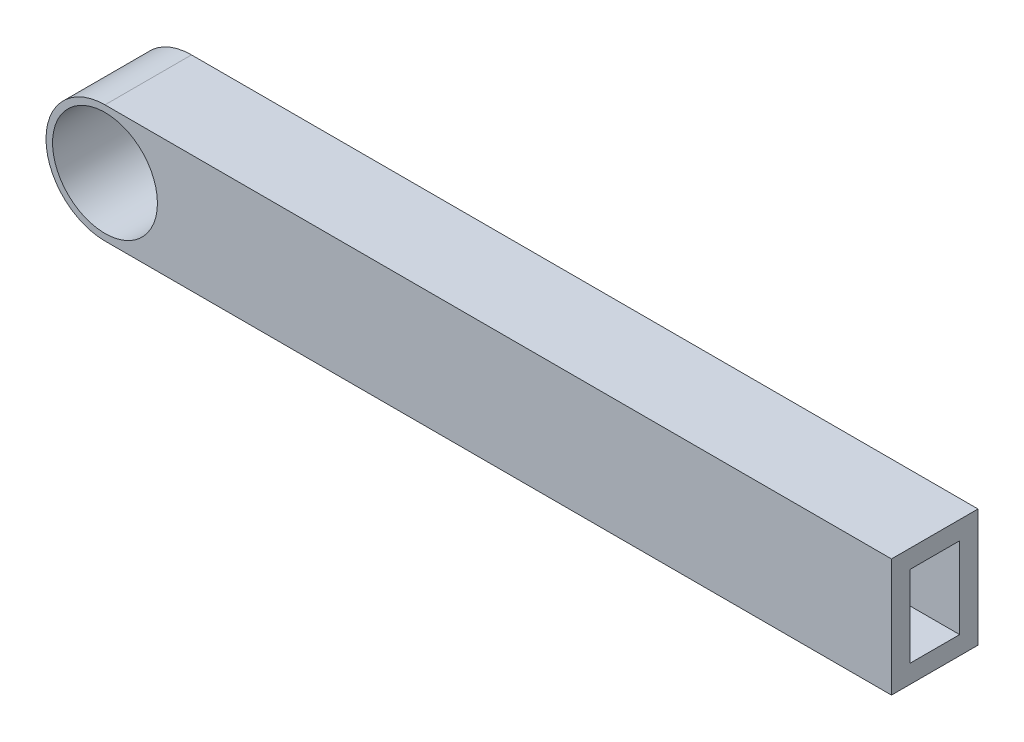
ISO-10303-21;
HEADER;
FILE_DESCRIPTION(('STEP AP214'),'2;1');
FILE_NAME('part.step','',(''),(''),'','','');
FILE_SCHEMA(('AUTOMOTIVE_DESIGN { 1 0 10303 214 1 1 1 1 }'));
ENDSEC;
DATA;
#1=APPLICATION_CONTEXT('core data for automotive mechanical design processes');
#2=APPLICATION_PROTOCOL_DEFINITION('international standard','automotive_design',2000,#1);
#3=PRODUCT_CONTEXT('',#1,'mechanical');
#4=PRODUCT('Part','Part','',(#3));
#5=PRODUCT_RELATED_PRODUCT_CATEGORY('part','',(#4));
#6=PRODUCT_DEFINITION_FORMATION('','',#4);
#7=PRODUCT_DEFINITION_CONTEXT('part definition',#1,'design');
#8=PRODUCT_DEFINITION('design','',#6,#7);
#9=PRODUCT_DEFINITION_SHAPE('','',#8);
#10=(LENGTH_UNIT() NAMED_UNIT(*) SI_UNIT(.MILLI.,.METRE.));
#11=(NAMED_UNIT(*) PLANE_ANGLE_UNIT() SI_UNIT($,.RADIAN.));
#12=(NAMED_UNIT(*) SI_UNIT($,.STERADIAN.) SOLID_ANGLE_UNIT());
#13=UNCERTAINTY_MEASURE_WITH_UNIT(LENGTH_MEASURE(1.E-05),#10,'distance_accuracy_value','');
#14=(GEOMETRIC_REPRESENTATION_CONTEXT(3) GLOBAL_UNCERTAINTY_ASSIGNED_CONTEXT((#13)) GLOBAL_UNIT_ASSIGNED_CONTEXT((#10,
#11,#12)) REPRESENTATION_CONTEXT('',''));
#15=CARTESIAN_POINT('',(0.,0.,0.));
#16=DIRECTION('',(0.,0.,1.));
#17=DIRECTION('',(1.,0.,0.));
#18=AXIS2_PLACEMENT_3D('',#15,#16,#17);
#19=CARTESIAN_POINT('',(-165.,-22.5,33.));
#20=DIRECTION('',(0.,1.,0.));
#21=DIRECTION('',(-1.,0.,0.));
#22=AXIS2_PLACEMENT_3D('',#19,#20,#21);
#23=PLANE('',#22);
#24=DIRECTION('',(1.,0.,0.));
#25=VECTOR('',#24,1.);
#26=CARTESIAN_POINT('',(-165.,-22.5,33.));
#27=LINE('',#26,#25);
#28=CARTESIAN_POINT('',(-135.,-22.5,33.));
#29=VERTEX_POINT('',#28);
#30=CARTESIAN_POINT('',(165.,-22.5,33.));
#31=VERTEX_POINT('',#30);
#32=EDGE_CURVE('E166',#29,#31,#27,.T.);
#33=ORIENTED_EDGE('',*,*,#32,.F.);
#34=DIRECTION('',(0.,0.,1.));
#35=VECTOR('',#34,1.);
#36=CARTESIAN_POINT('',(-135.,-22.5,-7.));
#37=LINE('',#36,#35);
#38=CARTESIAN_POINT('',(-135.,-22.5,0.));
#39=VERTEX_POINT('',#38);
#40=EDGE_CURVE('E156',#39,#29,#37,.T.);
#41=ORIENTED_EDGE('',*,*,#40,.F.);
#42=DIRECTION('',(1.,0.,0.));
#43=VECTOR('',#42,1.);
#44=CARTESIAN_POINT('',(-165.,-22.5,0.));
#45=LINE('',#44,#43);
#46=CARTESIAN_POINT('',(165.,-22.5,0.));
#47=VERTEX_POINT('',#46);
#48=EDGE_CURVE('E178',#39,#47,#45,.T.);
#49=ORIENTED_EDGE('',*,*,#48,.T.);
#50=DIRECTION('',(0.,0.,-1.));
#51=VECTOR('',#50,1.);
#52=CARTESIAN_POINT('',(165.,-22.5,33.));
#53=LINE('',#52,#51);
#54=EDGE_CURVE('E47',#31,#47,#53,.T.);
#55=ORIENTED_EDGE('',*,*,#54,.F.);
#56=EDGE_LOOP('',(#33,#41,#49,#55));
#57=FACE_BOUND('',#56,.T.);
#58=ADVANCED_FACE('F39',(#57),#23,.F.);
#59=CARTESIAN_POINT('',(165.,-22.5,33.));
#60=DIRECTION('',(-1.,0.,0.));
#61=DIRECTION('',(0.,0.,1.));
#62=AXIS2_PLACEMENT_3D('',#59,#60,#61);
#63=PLANE('',#62);
#64=DIRECTION('',(0.,0.,1.));
#65=VECTOR('',#64,1.);
#66=CARTESIAN_POINT('',(165.,15.5,26.));
#67=LINE('',#66,#65);
#68=CARTESIAN_POINT('',(165.,15.5,7.00000000000001));
#69=VERTEX_POINT('',#68);
#70=CARTESIAN_POINT('',(165.,15.5,26.));
#71=VERTEX_POINT('',#70);
#72=EDGE_CURVE('E139',#69,#71,#67,.T.);
#73=ORIENTED_EDGE('',*,*,#72,.F.);
#74=DIRECTION('',(0.,1.,0.));
#75=VECTOR('',#74,1.);
#76=CARTESIAN_POINT('',(165.,-15.5,7.));
#77=LINE('',#76,#75);
#78=CARTESIAN_POINT('',(165.,-15.5,7.));
#79=VERTEX_POINT('',#78);
#80=EDGE_CURVE('E54',#79,#69,#77,.T.);
#81=ORIENTED_EDGE('',*,*,#80,.F.);
#82=DIRECTION('',(0.,0.,-1.));
#83=VECTOR('',#82,1.);
#84=CARTESIAN_POINT('',(165.,-15.5,26.));
#85=LINE('',#84,#83);
#86=CARTESIAN_POINT('',(165.,-15.5,26.));
#87=VERTEX_POINT('',#86);
#88=EDGE_CURVE('E126',#87,#79,#85,.T.);
#89=ORIENTED_EDGE('',*,*,#88,.F.);
#90=DIRECTION('',(0.,-1.,0.));
#91=VECTOR('',#90,1.);
#92=CARTESIAN_POINT('',(165.,-15.5,26.));
#93=LINE('',#92,#91);
#94=EDGE_CURVE('E130',#71,#87,#93,.T.);
#95=ORIENTED_EDGE('',*,*,#94,.F.);
#96=EDGE_LOOP('',(#73,#81,#89,#95));
#97=FACE_BOUND('',#96,.T.);
#98=DIRECTION('',(0.,1.,0.));
#99=VECTOR('',#98,1.);
#100=CARTESIAN_POINT('',(165.,-22.5,0.));
#101=LINE('',#100,#99);
#102=CARTESIAN_POINT('',(165.,22.5,0.));
#103=VERTEX_POINT('',#102);
#104=EDGE_CURVE('E181',#47,#103,#101,.T.);
#105=ORIENTED_EDGE('',*,*,#104,.T.);
#106=DIRECTION('',(0.,0.,-1.));
#107=VECTOR('',#106,1.);
#108=CARTESIAN_POINT('',(165.,22.5,33.));
#109=LINE('',#108,#107);
#110=CARTESIAN_POINT('',(165.,22.5,33.));
#111=VERTEX_POINT('',#110);
#112=EDGE_CURVE('E177',#111,#103,#109,.T.);
#113=ORIENTED_EDGE('',*,*,#112,.F.);
#114=DIRECTION('',(0.,1.,0.));
#115=VECTOR('',#114,1.);
#116=CARTESIAN_POINT('',(165.,-22.5,33.));
#117=LINE('',#116,#115);
#118=EDGE_CURVE('E169',#31,#111,#117,.T.);
#119=ORIENTED_EDGE('',*,*,#118,.F.);
#120=ORIENTED_EDGE('',*,*,#54,.T.);
#121=EDGE_LOOP('',(#105,#113,#119,#120));
#122=FACE_BOUND('',#121,.T.);
#123=ADVANCED_FACE('F213',(#97,#122),#63,.F.);
#124=CARTESIAN_POINT('',(-165.,22.5,33.));
#125=DIRECTION('',(0.,-1.,0.));
#126=DIRECTION('',(1.,0.,0.));
#127=AXIS2_PLACEMENT_3D('',#124,#125,#126);
#128=PLANE('',#127);
#129=DIRECTION('',(-1.,0.,0.));
#130=VECTOR('',#129,1.);
#131=CARTESIAN_POINT('',(-165.,22.5,0.));
#132=LINE('',#131,#130);
#133=CARTESIAN_POINT('',(-135.,22.5,0.));
#134=VERTEX_POINT('',#133);
#135=EDGE_CURVE('E170',#103,#134,#132,.T.);
#136=ORIENTED_EDGE('',*,*,#135,.T.);
#137=DIRECTION('',(0.,0.,1.));
#138=VECTOR('',#137,1.);
#139=CARTESIAN_POINT('',(-135.,22.5,-7.));
#140=LINE('',#139,#138);
#141=CARTESIAN_POINT('',(-135.,22.5,33.));
#142=VERTEX_POINT('',#141);
#143=EDGE_CURVE('E62',#134,#142,#140,.T.);
#144=ORIENTED_EDGE('',*,*,#143,.T.);
#145=DIRECTION('',(-1.,0.,0.));
#146=VECTOR('',#145,1.);
#147=CARTESIAN_POINT('',(-165.,22.5,33.));
#148=LINE('',#147,#146);
#149=EDGE_CURVE('E173',#111,#142,#148,.T.);
#150=ORIENTED_EDGE('',*,*,#149,.F.);
#151=ORIENTED_EDGE('',*,*,#112,.T.);
#152=EDGE_LOOP('',(#136,#144,#150,#151));
#153=FACE_BOUND('',#152,.T.);
#154=ADVANCED_FACE('F218',(#153),#128,.F.);
#155=CARTESIAN_POINT('',(0.,0.,33.));
#156=DIRECTION('',(0.,0.,1.));
#157=DIRECTION('',(1.,0.,0.));
#158=AXIS2_PLACEMENT_3D('',#155,#156,#157);
#159=PLANE('',#158);
#160=CARTESIAN_POINT('',(-135.,0.,33.));
#161=DIRECTION('',(0.,0.,-1.));
#162=DIRECTION('',(1.,0.,0.));
#163=AXIS2_PLACEMENT_3D('',#160,#161,#162);
#164=CIRCLE('',#163,22.5);
#165=EDGE_CURVE('E148',#29,#142,#164,.T.);
#166=ORIENTED_EDGE('',*,*,#165,.F.);
#167=ORIENTED_EDGE('',*,*,#32,.T.);
#168=ORIENTED_EDGE('',*,*,#118,.T.);
#169=ORIENTED_EDGE('',*,*,#149,.T.);
#170=EDGE_LOOP('',(#166,#167,#168,#169));
#171=FACE_BOUND('',#170,.T.);
#172=CARTESIAN_POINT('',(-135.,0.,33.));
#173=DIRECTION('',(0.,0.,1.));
#174=DIRECTION('',(1.,0.,0.));
#175=AXIS2_PLACEMENT_3D('',#172,#173,#174);
#176=CIRCLE('',#175,20.);
#177=CARTESIAN_POINT('',(-115.,0.,33.));
#178=VERTEX_POINT('',#177);
#179=EDGE_CURVE('E159',#178,#178,#176,.T.);
#180=ORIENTED_EDGE('',*,*,#179,.F.);
#181=EDGE_LOOP('',(#180));
#182=FACE_BOUND('',#181,.T.);
#183=ADVANCED_FACE('F209',(#171,#182),#159,.T.);
#184=CARTESIAN_POINT('',(0.,0.,0.));
#185=DIRECTION('',(0.,0.,1.));
#186=DIRECTION('',(1.,0.,0.));
#187=AXIS2_PLACEMENT_3D('',#184,#185,#186);
#188=PLANE('',#187);
#189=CARTESIAN_POINT('',(-135.,0.,0.));
#190=DIRECTION('',(0.,0.,1.));
#191=DIRECTION('',(1.,0.,0.));
#192=AXIS2_PLACEMENT_3D('',#189,#190,#191);
#193=CIRCLE('',#192,20.);
#194=CARTESIAN_POINT('',(-115.,0.,0.));
#195=VERTEX_POINT('',#194);
#196=EDGE_CURVE('E165',#195,#195,#193,.T.);
#197=ORIENTED_EDGE('',*,*,#196,.T.);
#198=EDGE_LOOP('',(#197));
#199=FACE_BOUND('',#198,.T.);
#200=ORIENTED_EDGE('',*,*,#48,.F.);
#201=CARTESIAN_POINT('',(-135.,0.,0.));
#202=DIRECTION('',(0.,0.,1.));
#203=DIRECTION('',(1.,0.,0.));
#204=AXIS2_PLACEMENT_3D('',#201,#202,#203);
#205=CIRCLE('',#204,22.5);
#206=EDGE_CURVE('E11',#39,#134,#205,.F.);
#207=ORIENTED_EDGE('',*,*,#206,.T.);
#208=ORIENTED_EDGE('',*,*,#135,.F.);
#209=ORIENTED_EDGE('',*,*,#104,.F.);
#210=EDGE_LOOP('',(#200,#207,#208,#209));
#211=FACE_BOUND('',#210,.T.);
#212=ADVANCED_FACE('F196',(#199,#211),#188,.F.);
#213=CARTESIAN_POINT('',(-135.,0.,-7.));
#214=DIRECTION('',(0.,0.,1.));
#215=DIRECTION('',(1.,0.,0.));
#216=AXIS2_PLACEMENT_3D('',#213,#214,#215);
#217=CYLINDRICAL_SURFACE('',#216,20.);
#218=ORIENTED_EDGE('',*,*,#179,.T.);
#219=EDGE_LOOP('',(#218));
#220=FACE_BOUND('',#219,.T.);
#221=ORIENTED_EDGE('',*,*,#196,.F.);
#222=EDGE_LOOP('',(#221));
#223=FACE_BOUND('',#222,.T.);
#224=ADVANCED_FACE('F199',(#220,#223),#217,.F.);
#225=CARTESIAN_POINT('',(-135.,0.,-7.));
#226=DIRECTION('',(0.,0.,1.));
#227=DIRECTION('',(1.,0.,0.));
#228=AXIS2_PLACEMENT_3D('',#225,#226,#227);
#229=CYLINDRICAL_SURFACE('',#228,22.5);
#230=ORIENTED_EDGE('',*,*,#40,.T.);
#231=ORIENTED_EDGE('',*,*,#165,.T.);
#232=ORIENTED_EDGE('',*,*,#143,.F.);
#233=ORIENTED_EDGE('',*,*,#206,.F.);
#234=EDGE_LOOP('',(#230,#231,#232,#233));
#235=FACE_BOUND('',#234,.T.);
#236=ADVANCED_FACE('F201',(#235),#229,.T.);
#237=CARTESIAN_POINT('',(-95.,-15.5,7.));
#238=DIRECTION('',(0.,0.,-1.));
#239=DIRECTION('',(0.,1.,0.));
#240=AXIS2_PLACEMENT_3D('',#237,#238,#239);
#241=PLANE('',#240);
#242=ORIENTED_EDGE('',*,*,#80,.T.);
#243=DIRECTION('',(1.,0.,0.));
#244=VECTOR('',#243,1.);
#245=CARTESIAN_POINT('',(-95.,15.5,7.00000000000001));
#246=LINE('',#245,#244);
#247=CARTESIAN_POINT('',(-95.,15.5,7.00000000000001));
#248=VERTEX_POINT('',#247);
#249=EDGE_CURVE('E101',#248,#69,#246,.T.);
#250=ORIENTED_EDGE('',*,*,#249,.F.);
#251=DIRECTION('',(0.,1.,0.));
#252=VECTOR('',#251,1.);
#253=CARTESIAN_POINT('',(-95.,-15.5,7.));
#254=LINE('',#253,#252);
#255=CARTESIAN_POINT('',(-95.,-15.5,7.));
#256=VERTEX_POINT('',#255);
#257=EDGE_CURVE('E105',#256,#248,#254,.T.);
#258=ORIENTED_EDGE('',*,*,#257,.F.);
#259=DIRECTION('',(1.,0.,0.));
#260=VECTOR('',#259,1.);
#261=CARTESIAN_POINT('',(-95.,-15.5,7.));
#262=LINE('',#261,#260);
#263=EDGE_CURVE('E145',#256,#79,#262,.T.);
#264=ORIENTED_EDGE('',*,*,#263,.T.);
#265=EDGE_LOOP('',(#242,#250,#258,#264));
#266=FACE_BOUND('',#265,.T.);
#267=ADVANCED_FACE('F103',(#266),#241,.F.);
#268=CARTESIAN_POINT('',(-95.,-15.5,26.));
#269=DIRECTION('',(0.,-1.,0.));
#270=DIRECTION('',(0.,0.,-1.));
#271=AXIS2_PLACEMENT_3D('',#268,#269,#270);
#272=PLANE('',#271);
#273=ORIENTED_EDGE('',*,*,#88,.T.);
#274=ORIENTED_EDGE('',*,*,#263,.F.);
#275=DIRECTION('',(0.,0.,-1.));
#276=VECTOR('',#275,1.);
#277=CARTESIAN_POINT('',(-95.,-15.5,26.));
#278=LINE('',#277,#276);
#279=CARTESIAN_POINT('',(-95.,-15.5,26.));
#280=VERTEX_POINT('',#279);
#281=EDGE_CURVE('E112',#280,#256,#278,.T.);
#282=ORIENTED_EDGE('',*,*,#281,.F.);
#283=DIRECTION('',(1.,0.,0.));
#284=VECTOR('',#283,1.);
#285=CARTESIAN_POINT('',(-95.,-15.5,26.));
#286=LINE('',#285,#284);
#287=EDGE_CURVE('E149',#280,#87,#286,.T.);
#288=ORIENTED_EDGE('',*,*,#287,.T.);
#289=EDGE_LOOP('',(#273,#274,#282,#288));
#290=FACE_BOUND('',#289,.T.);
#291=ADVANCED_FACE('F272',(#290),#272,.F.);
#292=CARTESIAN_POINT('',(-95.,-15.5,26.));
#293=DIRECTION('',(0.,0.,1.));
#294=DIRECTION('',(0.,-1.,0.));
#295=AXIS2_PLACEMENT_3D('',#292,#293,#294);
#296=PLANE('',#295);
#297=ORIENTED_EDGE('',*,*,#94,.T.);
#298=ORIENTED_EDGE('',*,*,#287,.F.);
#299=DIRECTION('',(0.,-1.,0.));
#300=VECTOR('',#299,1.);
#301=CARTESIAN_POINT('',(-95.,-15.5,26.));
#302=LINE('',#301,#300);
#303=CARTESIAN_POINT('',(-95.,15.5,26.));
#304=VERTEX_POINT('',#303);
#305=EDGE_CURVE('E121',#304,#280,#302,.T.);
#306=ORIENTED_EDGE('',*,*,#305,.F.);
#307=DIRECTION('',(1.,0.,0.));
#308=VECTOR('',#307,1.);
#309=CARTESIAN_POINT('',(-95.,15.5,26.));
#310=LINE('',#309,#308);
#311=EDGE_CURVE('E111',#304,#71,#310,.T.);
#312=ORIENTED_EDGE('',*,*,#311,.T.);
#313=EDGE_LOOP('',(#297,#298,#306,#312));
#314=FACE_BOUND('',#313,.T.);
#315=ADVANCED_FACE('F281',(#314),#296,.F.);
#316=CARTESIAN_POINT('',(-95.,15.5,26.));
#317=DIRECTION('',(0.,1.,0.));
#318=DIRECTION('',(0.,0.,1.));
#319=AXIS2_PLACEMENT_3D('',#316,#317,#318);
#320=PLANE('',#319);
#321=ORIENTED_EDGE('',*,*,#72,.T.);
#322=ORIENTED_EDGE('',*,*,#311,.F.);
#323=DIRECTION('',(0.,0.,1.));
#324=VECTOR('',#323,1.);
#325=CARTESIAN_POINT('',(-95.,15.5,26.));
#326=LINE('',#325,#324);
#327=EDGE_CURVE('E115',#248,#304,#326,.T.);
#328=ORIENTED_EDGE('',*,*,#327,.F.);
#329=ORIENTED_EDGE('',*,*,#249,.T.);
#330=EDGE_LOOP('',(#321,#322,#328,#329));
#331=FACE_BOUND('',#330,.T.);
#332=ADVANCED_FACE('F116',(#331),#320,.F.);
#333=CARTESIAN_POINT('',(-95.,0.,0.));
#334=DIRECTION('',(-1.,0.,0.));
#335=DIRECTION('',(0.,0.,1.));
#336=AXIS2_PLACEMENT_3D('',#333,#334,#335);
#337=PLANE('',#336);
#338=ORIENTED_EDGE('',*,*,#257,.T.);
#339=ORIENTED_EDGE('',*,*,#327,.T.);
#340=ORIENTED_EDGE('',*,*,#305,.T.);
#341=ORIENTED_EDGE('',*,*,#281,.T.);
#342=EDGE_LOOP('',(#338,#339,#340,#341));
#343=FACE_BOUND('',#342,.T.);
#344=ADVANCED_FACE('F123',(#343),#337,.F.);
#345=CLOSED_SHELL('',(#58,#123,#154,#183,#212,#224,#236,#267,#291,#315,#332,#344));
#346=MANIFOLD_SOLID_BREP('B2',#345);
#347=ADVANCED_BREP_SHAPE_REPRESENTATION('',(#18,#346),#14);
#348=SHAPE_DEFINITION_REPRESENTATION(#9,#347);
ENDSEC;
END-ISO-10303-21;
